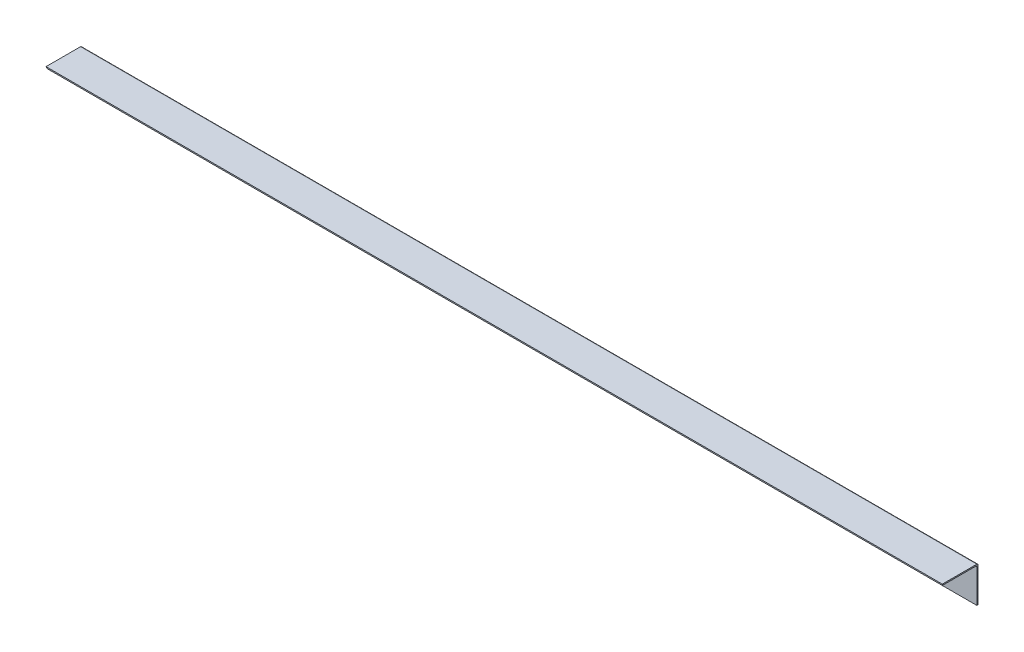
ISO-10303-21;
HEADER;
FILE_DESCRIPTION(('STEP AP214'),'2;1');
FILE_NAME('part.step','',(''),(''),'','','');
FILE_SCHEMA(('AUTOMOTIVE_DESIGN { 1 0 10303 214 1 1 1 1 }'));
ENDSEC;
DATA;
#1=APPLICATION_CONTEXT('core data for automotive mechanical design processes');
#2=APPLICATION_PROTOCOL_DEFINITION('international standard','automotive_design',2000,#1);
#3=PRODUCT_CONTEXT('',#1,'mechanical');
#4=PRODUCT('Part','Part','',(#3));
#5=PRODUCT_RELATED_PRODUCT_CATEGORY('part','',(#4));
#6=PRODUCT_DEFINITION_FORMATION('','',#4);
#7=PRODUCT_DEFINITION_CONTEXT('part definition',#1,'design');
#8=PRODUCT_DEFINITION('design','',#6,#7);
#9=PRODUCT_DEFINITION_SHAPE('','',#8);
#10=(LENGTH_UNIT() NAMED_UNIT(*) SI_UNIT(.MILLI.,.METRE.));
#11=(NAMED_UNIT(*) PLANE_ANGLE_UNIT() SI_UNIT($,.RADIAN.));
#12=(NAMED_UNIT(*) SI_UNIT($,.STERADIAN.) SOLID_ANGLE_UNIT());
#13=UNCERTAINTY_MEASURE_WITH_UNIT(LENGTH_MEASURE(1.E-05),#10,'distance_accuracy_value','');
#14=(GEOMETRIC_REPRESENTATION_CONTEXT(3) GLOBAL_UNCERTAINTY_ASSIGNED_CONTEXT((#13)) GLOBAL_UNIT_ASSIGNED_CONTEXT((#10,
#11,#12)) REPRESENTATION_CONTEXT('',''));
#15=CARTESIAN_POINT('',(0.,0.,0.));
#16=DIRECTION('',(0.,0.,1.));
#17=DIRECTION('',(1.,0.,0.));
#18=AXIS2_PLACEMENT_3D('',#15,#16,#17);
#19=CARTESIAN_POINT('',(2210.,0.,0.));
#20=DIRECTION('',(0.,0.,-1.));
#21=DIRECTION('',(-1.,0.,0.));
#22=AXIS2_PLACEMENT_3D('',#19,#20,#21);
#23=PLANE('',#22);
#24=DIRECTION('',(-1.,0.,0.));
#25=VECTOR('',#24,1.);
#26=CARTESIAN_POINT('',(2210.,0.,0.));
#27=LINE('',#26,#25);
#28=CARTESIAN_POINT('',(2210.,0.,0.));
#29=VERTEX_POINT('',#28);
#30=CARTESIAN_POINT('',(0.,0.,0.));
#31=VERTEX_POINT('',#30);
#32=EDGE_CURVE('E124',#29,#31,#27,.T.);
#33=ORIENTED_EDGE('',*,*,#32,.T.);
#34=DIRECTION('',(0.707106781186544,-0.707106781186551,0.));
#35=VECTOR('',#34,1.);
#36=CARTESIAN_POINT('',(0.,0.,0.));
#37=LINE('',#36,#35);
#38=CARTESIAN_POINT('',(3.00000000000009,-3.00000000000005,0.));
#39=VERTEX_POINT('',#38);
#40=EDGE_CURVE('E105',#31,#39,#37,.T.);
#41=ORIENTED_EDGE('',*,*,#40,.T.);
#42=DIRECTION('',(-1.,0.,0.));
#43=VECTOR('',#42,1.);
#44=CARTESIAN_POINT('',(2210.,-3.,0.));
#45=LINE('',#44,#43);
#46=CARTESIAN_POINT('',(2210.,-3.,0.));
#47=VERTEX_POINT('',#46);
#48=EDGE_CURVE('E147',#47,#39,#45,.T.);
#49=ORIENTED_EDGE('',*,*,#48,.F.);
#50=DIRECTION('',(0.,-1.,0.));
#51=VECTOR('',#50,1.);
#52=CARTESIAN_POINT('',(2210.,0.,0.));
#53=LINE('',#52,#51);
#54=EDGE_CURVE('E129',#29,#47,#53,.T.);
#55=ORIENTED_EDGE('',*,*,#54,.F.);
#56=EDGE_LOOP('',(#33,#41,#49,#55));
#57=FACE_BOUND('',#56,.T.);
#58=ADVANCED_FACE('F39',(#57),#23,.F.);
#59=CARTESIAN_POINT('',(2210.,-3.,0.));
#60=DIRECTION('',(0.,1.,0.));
#61=DIRECTION('',(0.,0.,1.));
#62=AXIS2_PLACEMENT_3D('',#59,#60,#61);
#63=PLANE('',#62);
#64=ORIENTED_EDGE('',*,*,#48,.T.);
#65=DIRECTION('',(0.,0.,-1.));
#66=VECTOR('',#65,1.);
#67=CARTESIAN_POINT('',(3.00000000000011,-3.,-6.96097220269232E-13));
#68=LINE('',#67,#66);
#69=CARTESIAN_POINT('',(2.99999999999967,-3.,-82.));
#70=VERTEX_POINT('',#69);
#71=EDGE_CURVE('E111',#39,#70,#68,.T.);
#72=ORIENTED_EDGE('',*,*,#71,.T.);
#73=DIRECTION('',(-1.,0.,0.));
#74=VECTOR('',#73,1.);
#75=CARTESIAN_POINT('',(2210.,-3.,-82.));
#76=LINE('',#75,#74);
#77=CARTESIAN_POINT('',(2210.,-3.,-82.));
#78=VERTEX_POINT('',#77);
#79=EDGE_CURVE('E154',#70,#78,#76,.F.);
#80=ORIENTED_EDGE('',*,*,#79,.T.);
#81=DIRECTION('',(0.,0.,-1.));
#82=VECTOR('',#81,1.);
#83=CARTESIAN_POINT('',(2210.,-3.,0.));
#84=LINE('',#83,#82);
#85=EDGE_CURVE('E169',#47,#78,#84,.T.);
#86=ORIENTED_EDGE('',*,*,#85,.F.);
#87=EDGE_LOOP('',(#64,#72,#80,#86));
#88=FACE_BOUND('',#87,.T.);
#89=ADVANCED_FACE('F215',(#88),#63,.F.);
#90=CARTESIAN_POINT('',(2210.,-3.,-85.));
#91=DIRECTION('',(0.,0.,-1.));
#92=DIRECTION('',(-1.,0.,0.));
#93=AXIS2_PLACEMENT_3D('',#90,#91,#92);
#94=PLANE('',#93);
#95=DIRECTION('',(-1.,0.,0.));
#96=VECTOR('',#95,1.);
#97=CARTESIAN_POINT('',(0.,-6.,-85.));
#98=LINE('',#97,#96);
#99=CARTESIAN_POINT('',(2210.,-6.,-85.));
#100=VERTEX_POINT('',#99);
#101=CARTESIAN_POINT('',(5.99999999999979,-6.,-85.));
#102=VERTEX_POINT('',#101);
#103=EDGE_CURVE('E150',#100,#102,#98,.T.);
#104=ORIENTED_EDGE('',*,*,#103,.T.);
#105=DIRECTION('',(0.707106781186544,-0.707106781186551,0.));
#106=VECTOR('',#105,1.);
#107=CARTESIAN_POINT('',(1106.49999999999,-1106.5,-85.));
#108=LINE('',#107,#106);
#109=CARTESIAN_POINT('',(87.9999999999992,-88.,-85.));
#110=VERTEX_POINT('',#109);
#111=EDGE_CURVE('E184',#102,#110,#108,.T.);
#112=ORIENTED_EDGE('',*,*,#111,.T.);
#113=DIRECTION('',(-1.,0.,0.));
#114=VECTOR('',#113,1.);
#115=CARTESIAN_POINT('',(2210.,-88.,-85.));
#116=LINE('',#115,#114);
#117=CARTESIAN_POINT('',(2210.,-88.,-85.));
#118=VERTEX_POINT('',#117);
#119=EDGE_CURVE('E139',#118,#110,#116,.T.);
#120=ORIENTED_EDGE('',*,*,#119,.F.);
#121=DIRECTION('',(0.,-1.,0.));
#122=VECTOR('',#121,1.);
#123=CARTESIAN_POINT('',(2210.,-3.,-85.));
#124=LINE('',#123,#122);
#125=EDGE_CURVE('E167',#100,#118,#124,.T.);
#126=ORIENTED_EDGE('',*,*,#125,.F.);
#127=EDGE_LOOP('',(#104,#112,#120,#126));
#128=FACE_BOUND('',#127,.T.);
#129=ADVANCED_FACE('F174',(#128),#94,.F.);
#130=CARTESIAN_POINT('',(2210.,-88.,-85.));
#131=DIRECTION('',(0.,1.,0.));
#132=DIRECTION('',(0.,0.,1.));
#133=AXIS2_PLACEMENT_3D('',#130,#131,#132);
#134=PLANE('',#133);
#135=ORIENTED_EDGE('',*,*,#119,.T.);
#136=DIRECTION('',(0.,0.,-1.));
#137=VECTOR('',#136,1.);
#138=CARTESIAN_POINT('',(87.9999999999992,-88.,0.));
#139=LINE('',#138,#137);
#140=CARTESIAN_POINT('',(87.9999999999992,-88.,-88.));
#141=VERTEX_POINT('',#140);
#142=EDGE_CURVE('E117',#110,#141,#139,.T.);
#143=ORIENTED_EDGE('',*,*,#142,.T.);
#144=DIRECTION('',(-1.,0.,0.));
#145=VECTOR('',#144,1.);
#146=CARTESIAN_POINT('',(2210.,-88.,-88.));
#147=LINE('',#146,#145);
#148=CARTESIAN_POINT('',(2210.,-88.,-88.));
#149=VERTEX_POINT('',#148);
#150=EDGE_CURVE('E133',#149,#141,#147,.T.);
#151=ORIENTED_EDGE('',*,*,#150,.F.);
#152=DIRECTION('',(0.,0.,-1.));
#153=VECTOR('',#152,1.);
#154=CARTESIAN_POINT('',(2210.,-88.,-85.));
#155=LINE('',#154,#153);
#156=EDGE_CURVE('E178',#118,#149,#155,.T.);
#157=ORIENTED_EDGE('',*,*,#156,.F.);
#158=EDGE_LOOP('',(#135,#143,#151,#157));
#159=FACE_BOUND('',#158,.T.);
#160=ADVANCED_FACE('F207',(#159),#134,.F.);
#161=CARTESIAN_POINT('',(2210.,0.,-88.));
#162=DIRECTION('',(0.,0.,1.));
#163=DIRECTION('',(0.,-1.,0.));
#164=AXIS2_PLACEMENT_3D('',#161,#162,#163);
#165=PLANE('',#164);
#166=ORIENTED_EDGE('',*,*,#150,.T.);
#167=DIRECTION('',(0.707106781186544,-0.707106781186551,0.));
#168=VECTOR('',#167,1.);
#169=CARTESIAN_POINT('',(0.,0.,-88.));
#170=LINE('',#169,#168);
#171=CARTESIAN_POINT('',(3.00000000000009,-3.00000000000003,-88.));
#172=VERTEX_POINT('',#171);
#173=EDGE_CURVE('E118',#172,#141,#170,.T.);
#174=ORIENTED_EDGE('',*,*,#173,.F.);
#175=DIRECTION('',(-1.,0.,0.));
#176=VECTOR('',#175,1.);
#177=CARTESIAN_POINT('',(2210.,-3.,-88.));
#178=LINE('',#177,#176);
#179=CARTESIAN_POINT('',(2210.,-3.,-88.));
#180=VERTEX_POINT('',#179);
#181=EDGE_CURVE('E55',#172,#180,#178,.F.);
#182=ORIENTED_EDGE('',*,*,#181,.T.);
#183=DIRECTION('',(0.,1.,0.));
#184=VECTOR('',#183,1.);
#185=CARTESIAN_POINT('',(2210.,0.,-88.));
#186=LINE('',#185,#184);
#187=EDGE_CURVE('E141',#149,#180,#186,.T.);
#188=ORIENTED_EDGE('',*,*,#187,.F.);
#189=EDGE_LOOP('',(#166,#174,#182,#188));
#190=FACE_BOUND('',#189,.T.);
#191=ADVANCED_FACE('F204',(#190),#165,.F.);
#192=CARTESIAN_POINT('',(2210.,0.,0.));
#193=DIRECTION('',(0.,-1.,0.));
#194=DIRECTION('',(0.,0.,-1.));
#195=AXIS2_PLACEMENT_3D('',#192,#193,#194);
#196=PLANE('',#195);
#197=DIRECTION('',(0.,0.,1.));
#198=VECTOR('',#197,1.);
#199=CARTESIAN_POINT('',(2210.,0.,0.));
#200=LINE('',#199,#198);
#201=CARTESIAN_POINT('',(2210.,0.,-85.));
#202=VERTEX_POINT('',#201);
#203=EDGE_CURVE('E134',#202,#29,#200,.T.);
#204=ORIENTED_EDGE('',*,*,#203,.F.);
#205=DIRECTION('',(-1.,0.,0.));
#206=VECTOR('',#205,1.);
#207=CARTESIAN_POINT('',(2210.,0.,-85.));
#208=LINE('',#207,#206);
#209=CARTESIAN_POINT('',(0.,0.,-85.));
#210=VERTEX_POINT('',#209);
#211=EDGE_CURVE('E127',#202,#210,#208,.T.);
#212=ORIENTED_EDGE('',*,*,#211,.T.);
#213=DIRECTION('',(0.,0.,1.));
#214=VECTOR('',#213,1.);
#215=CARTESIAN_POINT('',(0.,0.,0.));
#216=LINE('',#215,#214);
#217=EDGE_CURVE('E108',#210,#31,#216,.T.);
#218=ORIENTED_EDGE('',*,*,#217,.T.);
#219=ORIENTED_EDGE('',*,*,#32,.F.);
#220=EDGE_LOOP('',(#204,#212,#218,#219));
#221=FACE_BOUND('',#220,.T.);
#222=ADVANCED_FACE('F123',(#221),#196,.F.);
#223=CARTESIAN_POINT('',(2210.,0.,0.));
#224=DIRECTION('',(1.,0.,0.));
#225=DIRECTION('',(0.,0.,-1.));
#226=AXIS2_PLACEMENT_3D('',#223,#224,#225);
#227=PLANE('',#226);
#228=ORIENTED_EDGE('',*,*,#187,.T.);
#229=CARTESIAN_POINT('',(2210.,-3.,-85.));
#230=DIRECTION('',(1.,0.,0.));
#231=DIRECTION('',(0.,0.,-1.));
#232=AXIS2_PLACEMENT_3D('',#229,#230,#231);
#233=CIRCLE('',#232,3.);
#234=EDGE_CURVE('E62',#180,#202,#233,.T.);
#235=ORIENTED_EDGE('',*,*,#234,.T.);
#236=ORIENTED_EDGE('',*,*,#203,.T.);
#237=ORIENTED_EDGE('',*,*,#54,.T.);
#238=ORIENTED_EDGE('',*,*,#85,.T.);
#239=CARTESIAN_POINT('',(2210.,-6.,-82.));
#240=DIRECTION('',(1.,0.,0.));
#241=DIRECTION('',(0.,0.,-1.));
#242=AXIS2_PLACEMENT_3D('',#239,#240,#241);
#243=CIRCLE('',#242,3.);
#244=EDGE_CURVE('E48',#78,#100,#243,.F.);
#245=ORIENTED_EDGE('',*,*,#244,.T.);
#246=ORIENTED_EDGE('',*,*,#125,.T.);
#247=ORIENTED_EDGE('',*,*,#156,.T.);
#248=EDGE_LOOP('',(#228,#235,#236,#237,#238,#245,#246,#247));
#249=FACE_BOUND('',#248,.T.);
#250=ADVANCED_FACE('F166',(#249),#227,.T.);
#251=CARTESIAN_POINT('',(2210.,-6.,-82.));
#252=DIRECTION('',(1.,0.,0.));
#253=DIRECTION('',(0.,0.,-1.));
#254=AXIS2_PLACEMENT_3D('',#251,#252,#253);
#255=CYLINDRICAL_SURFACE('',#254,3.);
#256=ORIENTED_EDGE('',*,*,#79,.F.);
#257=CARTESIAN_POINT('',(5.99999999999978,-6.,-82.));
#258=DIRECTION('',(0.707106781186551,0.707106781186544,0.));
#259=DIRECTION('',(0.707106781186544,-0.707106781186551,0.));
#260=AXIS2_PLACEMENT_3D('',#257,#258,#259);
#261=ELLIPSE('',#260,4.24264068711926,3.);
#262=EDGE_CURVE('E182',#70,#102,#261,.F.);
#263=ORIENTED_EDGE('',*,*,#262,.T.);
#264=ORIENTED_EDGE('',*,*,#103,.F.);
#265=ORIENTED_EDGE('',*,*,#244,.F.);
#266=EDGE_LOOP('',(#256,#263,#264,#265));
#267=FACE_BOUND('',#266,.T.);
#268=ADVANCED_FACE('F181',(#267),#255,.F.);
#269=CARTESIAN_POINT('',(2210.,-3.,-85.));
#270=DIRECTION('',(-1.,0.,0.));
#271=DIRECTION('',(0.,0.,1.));
#272=AXIS2_PLACEMENT_3D('',#269,#270,#271);
#273=CYLINDRICAL_SURFACE('',#272,3.);
#274=CARTESIAN_POINT('',(3.00000000000011,-3.,-85.));
#275=DIRECTION('',(0.707106781186551,0.707106781186544,0.));
#276=DIRECTION('',(-0.707106781186544,0.707106781186551,0.));
#277=AXIS2_PLACEMENT_3D('',#274,#275,#276);
#278=ELLIPSE('',#277,4.24264068711926,3.);
#279=EDGE_CURVE('E11',#210,#172,#278,.F.);
#280=ORIENTED_EDGE('',*,*,#279,.F.);
#281=ORIENTED_EDGE('',*,*,#211,.F.);
#282=ORIENTED_EDGE('',*,*,#234,.F.);
#283=ORIENTED_EDGE('',*,*,#181,.F.);
#284=EDGE_LOOP('',(#280,#281,#282,#283));
#285=FACE_BOUND('',#284,.T.);
#286=ADVANCED_FACE('F41',(#285),#273,.T.);
#287=CARTESIAN_POINT('',(0.,0.,0.));
#288=DIRECTION('',(0.707106781186551,0.707106781186544,0.));
#289=DIRECTION('',(-0.707106781186544,0.707106781186551,0.));
#290=AXIS2_PLACEMENT_3D('',#287,#288,#289);
#291=PLANE('',#290);
#292=ORIENTED_EDGE('',*,*,#40,.F.);
#293=ORIENTED_EDGE('',*,*,#217,.F.);
#294=ORIENTED_EDGE('',*,*,#279,.T.);
#295=ORIENTED_EDGE('',*,*,#173,.T.);
#296=ORIENTED_EDGE('',*,*,#142,.F.);
#297=ORIENTED_EDGE('',*,*,#111,.F.);
#298=ORIENTED_EDGE('',*,*,#262,.F.);
#299=ORIENTED_EDGE('',*,*,#71,.F.);
#300=EDGE_LOOP('',(#292,#293,#294,#295,#296,#297,#298,#299));
#301=FACE_BOUND('',#300,.T.);
#302=ADVANCED_FACE('F107',(#301),#291,.F.);
#303=CLOSED_SHELL('',(#58,#89,#129,#160,#191,#222,#250,#268,#286,#302));
#304=MANIFOLD_SOLID_BREP('B2',#303);
#305=ADVANCED_BREP_SHAPE_REPRESENTATION('',(#18,#304),#14);
#306=SHAPE_DEFINITION_REPRESENTATION(#9,#305);
ENDSEC;
END-ISO-10303-21;
